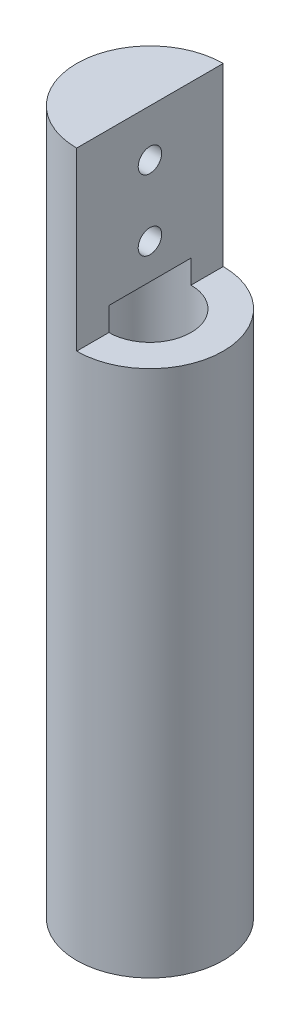
ISO-10303-21;
HEADER;
FILE_DESCRIPTION(('STEP AP214'),'2;1');
FILE_NAME('part.step','',(''),(''),'','','');
FILE_SCHEMA(('AUTOMOTIVE_DESIGN { 1 0 10303 214 1 1 1 1 }'));
ENDSEC;
DATA;
#1=APPLICATION_CONTEXT('core data for automotive mechanical design processes');
#2=APPLICATION_PROTOCOL_DEFINITION('international standard','automotive_design',2000,#1);
#3=PRODUCT_CONTEXT('',#1,'mechanical');
#4=PRODUCT('Part','Part','',(#3));
#5=PRODUCT_RELATED_PRODUCT_CATEGORY('part','',(#4));
#6=PRODUCT_DEFINITION_FORMATION('','',#4);
#7=PRODUCT_DEFINITION_CONTEXT('part definition',#1,'design');
#8=PRODUCT_DEFINITION('design','',#6,#7);
#9=PRODUCT_DEFINITION_SHAPE('','',#8);
#10=(LENGTH_UNIT() NAMED_UNIT(*) SI_UNIT(.MILLI.,.METRE.));
#11=(NAMED_UNIT(*) PLANE_ANGLE_UNIT() SI_UNIT($,.RADIAN.));
#12=(NAMED_UNIT(*) SI_UNIT($,.STERADIAN.) SOLID_ANGLE_UNIT());
#13=UNCERTAINTY_MEASURE_WITH_UNIT(LENGTH_MEASURE(1.E-05),#10,'distance_accuracy_value','');
#14=(GEOMETRIC_REPRESENTATION_CONTEXT(3) GLOBAL_UNCERTAINTY_ASSIGNED_CONTEXT((#13)) GLOBAL_UNIT_ASSIGNED_CONTEXT((#10,
#11,#12)) REPRESENTATION_CONTEXT('',''));
#15=CARTESIAN_POINT('',(0.,0.,0.));
#16=DIRECTION('',(0.,0.,1.));
#17=DIRECTION('',(1.,0.,0.));
#18=AXIS2_PLACEMENT_3D('',#15,#16,#17);
#19=CARTESIAN_POINT('',(0.,60.,0.));
#20=DIRECTION('',(0.,-1.,0.));
#21=DIRECTION('',(0.,0.,-1.));
#22=AXIS2_PLACEMENT_3D('',#19,#20,#21);
#23=CYLINDRICAL_SURFACE('',#22,6.25);
#24=CARTESIAN_POINT('',(-6.25,49.,0.));
#25=CARTESIAN_POINT('',(-6.24999906710497,49.0000022643151,-0.0557885100639667));
#26=CARTESIAN_POINT('',(-6.24924523381865,49.0046843036466,-0.111608261930167));
#27=CARTESIAN_POINT('',(-6.24631061709282,49.023282223849,-0.221684389829118));
#28=CARTESIAN_POINT('',(-6.24412848965522,49.0372068019501,-0.275939243067586));
#29=CARTESIAN_POINT('',(-6.23858223200645,49.073860440223,-0.381276885563142));
#30=CARTESIAN_POINT('',(-6.23521903869919,49.0965825230604,-0.432362151472));
#31=CARTESIAN_POINT('',(-6.22768119900577,49.1501683971989,-0.529987922172727));
#32=CARTESIAN_POINT('',(-6.22350665360427,49.1810311754418,-0.576528991474462));
#33=CARTESIAN_POINT('',(-6.21476821451689,49.2503128021312,-0.664163748023368));
#34=CARTESIAN_POINT('',(-6.21020150221518,49.2887894894726,-0.705211433262983));
#35=CARTESIAN_POINT('',(-6.20121519954691,49.3720822336375,-0.780297051418914));
#36=CARTESIAN_POINT('',(-6.19679561813248,49.4168986753343,-0.814334558453545));
#37=CARTESIAN_POINT('',(-6.18857666789098,49.511911943076,-0.87461582706607));
#38=CARTESIAN_POINT('',(-6.18478094174249,49.5621377186808,-0.900814499230483));
#39=CARTESIAN_POINT('',(-6.17827832974775,49.6663478314344,-0.944386154813034));
#40=CARTESIAN_POINT('',(-6.17557137625171,49.7203319348187,-0.961759686590047));
#41=CARTESIAN_POINT('',(-6.17158072371182,49.8300401884324,-0.987043793406639));
#42=CARTESIAN_POINT('',(-6.17028512650181,49.885745655475,-0.995033522252002));
#43=CARTESIAN_POINT('',(-6.16922783579555,49.9977204935427,-1.00156855668788));
#44=CARTESIAN_POINT('',(-6.16946604222119,50.0539898275372,-1.00011447847096));
#45=CARTESIAN_POINT('',(-6.17143857403019,50.1649325152495,-0.987867735290674));
#46=CARTESIAN_POINT('',(-6.17315870395883,50.2196159386805,-0.977163673632073));
#47=CARTESIAN_POINT('',(-6.17787906600869,50.326400535549,-0.946859717569204));
#48=CARTESIAN_POINT('',(-6.18087933888,50.3785016267254,-0.92725953997836));
#49=CARTESIAN_POINT('',(-6.18783740913301,50.4789096339279,-0.879628943736035));
#50=CARTESIAN_POINT('',(-6.19179940465345,50.5271986498427,-0.85156142908755));
#51=CARTESIAN_POINT('',(-6.20023154057462,50.6184151358427,-0.787819263161819));
#52=CARTESIAN_POINT('',(-6.20470171882556,50.6613422060616,-0.752144045077689));
#53=CARTESIAN_POINT('',(-6.21370906226269,50.7411294002187,-0.673714920439465));
#54=CARTESIAN_POINT('',(-6.21824641001355,50.7779147535344,-0.630884927728));
#55=CARTESIAN_POINT('',(-6.22682963542333,50.8437873694215,-0.539620187340265));
#56=CARTESIAN_POINT('',(-6.23087551035876,50.872874589335,-0.491185408608192));
#57=CARTESIAN_POINT('',(-6.2380250284972,50.922530839057,-0.390017944154561));
#58=CARTESIAN_POINT('',(-6.24112797878532,50.9430936086344,-0.337282133710767));
#59=CARTESIAN_POINT('',(-6.246036377968,50.975049678963,-0.229044916969888));
#60=CARTESIAN_POINT('',(-6.24784192679808,50.9864436859685,-0.173543724035369));
#61=CARTESIAN_POINT('',(-6.2499387322753,50.9996382350065,-0.0619960277009888));
#62=CARTESIAN_POINT('',(-6.25024619983784,51.0015414829788,-0.0059619668302225));
#63=CARTESIAN_POINT('',(-6.24935648754665,50.9959738091954,0.105624685755569));
#64=CARTESIAN_POINT('',(-6.24815936090275,50.9885032189443,0.161177294427142));
#65=CARTESIAN_POINT('',(-6.24440500076169,50.9644853509054,0.269909399117751));
#66=CARTESIAN_POINT('',(-6.24185533901278,50.9479885873477,0.323100337201038));
#67=CARTESIAN_POINT('',(-6.23568073073881,50.906440265735,0.425961495292994));
#68=CARTESIAN_POINT('',(-6.23205572782266,50.8813882590309,0.475631530495594));
#69=CARTESIAN_POINT('',(-6.22409260759213,50.8232030003483,0.570489325564433));
#70=CARTESIAN_POINT('',(-6.21974888779155,50.7900051819885,0.61563700154785));
#71=CARTESIAN_POINT('',(-6.21084797706853,50.7165599228187,0.69975707819764));
#72=CARTESIAN_POINT('',(-6.20629077194169,50.6763120124359,0.738729067201413));
#73=CARTESIAN_POINT('',(-6.19742451365368,50.589449805948,0.809769332650003));
#74=CARTESIAN_POINT('',(-6.1931182322689,50.5427786106066,0.841768437073598));
#75=CARTESIAN_POINT('',(-6.18529205150872,50.4446631094398,0.897472446050597));
#76=CARTESIAN_POINT('',(-6.18177212866728,50.3932189461114,0.921177598119176));
#77=CARTESIAN_POINT('',(-6.1759377060239,50.2872165203909,0.95951579177077));
#78=CARTESIAN_POINT('',(-6.17361852938612,50.2326712727011,0.97418407451258));
#79=CARTESIAN_POINT('',(-6.17043616110361,50.121851215004,0.994143592772298));
#80=CARTESIAN_POINT('',(-6.16957285371193,50.0655765428546,0.999435573742272));
#81=CARTESIAN_POINT('',(-6.16940468792846,49.9535852532817,1.00047273309197));
#82=CARTESIAN_POINT('',(-6.17008206410826,49.8978696402301,0.996326739107233));
#83=CARTESIAN_POINT('',(-6.17288014129105,49.7879393386864,0.978840089864877));
#84=CARTESIAN_POINT('',(-6.17500083863937,49.7337246463941,0.965499457889312));
#85=CARTESIAN_POINT('',(-6.18044007931005,49.6283723249918,0.930042609275316));
#86=CARTESIAN_POINT('',(-6.18375744215515,49.5772317211793,0.907935038850667));
#87=CARTESIAN_POINT('',(-6.1912174883704,49.4793677661635,0.855582886421217));
#88=CARTESIAN_POINT('',(-6.19536020736958,49.4326446057809,0.825337953122535));
#89=CARTESIAN_POINT('',(-6.20406084038506,49.3443907095817,0.757178317998384));
#90=CARTESIAN_POINT('',(-6.20862280108901,49.3029223760498,0.719183322904796));
#91=CARTESIAN_POINT('',(-6.21761500649877,49.2269123093012,0.636771671789766));
#92=CARTESIAN_POINT('',(-6.22204522048498,49.1923721809256,0.592353532010026));
#93=CARTESIAN_POINT('',(-6.23030702814576,49.1310012669141,0.498024173288674));
#94=CARTESIAN_POINT('',(-6.23413466326479,49.1042205630563,0.448080024897432));
#95=CARTESIAN_POINT('',(-6.2407214375234,49.0594693535505,0.344362583484336));
#96=CARTESIAN_POINT('',(-6.24348165781165,49.041489928448,0.290593230604882));
#97=CARTESIAN_POINT('',(-6.24700877948195,49.0188271306323,0.197167759419022));
#98=CARTESIAN_POINT('',(-6.24812458891587,49.0117780486036,0.158081738749348));
#99=CARTESIAN_POINT('',(-6.2496205253357,49.0023637135682,0.0793357400758528));
#100=CARTESIAN_POINT('',(-6.25000066345793,48.9999983896604,0.0396757707694141));
#101=CARTESIAN_POINT('',(-6.25,49.,0.));
#102=B_SPLINE_CURVE_WITH_KNOTS('',3,(#24,#25,#26,#27,#28,#29,#30,#31,#32,#33,#34,#35,#36,#37,
#38,#39,#40,#41,#42,#43,#44,#45,#46,#47,#48,#49,#50,#51,#52,#53,#54,#55,#56,#57,#58,#59,#60,#61,
#62,#63,#64,#65,#66,#67,#68,#69,#70,#71,#72,#73,#74,#75,#76,#77,#78,#79,#80,#81,#82,#83,#84,#85,
#86,#87,#88,#89,#90,#91,#92,#93,#94,#95,#96,#97,#98,#99,#100,#101),.UNSPECIFIED.,.T.,.F.,(4,2,2,
2,2,2,2,2,2,2,2,2,2,2,2,2,2,2,2,2,2,2,2,2,2,2,2,2,2,2,2,2,2,2,2,2,2,2,4),(0.,0.167220523311472,
0.334598624659732,0.501844248828423,0.669069070145514,0.837616673041163,1.0061745125064,
1.17568404812973,1.34518304982069,1.51324179234824,1.68128956943513,1.8477452794525,
2.01420628856096,2.18140743534158,2.34862104368742,2.51774156668694,2.6868630268186,
2.85610846818009,3.02534087160097,3.19273786075057,3.36012893009067,3.52659265113524,
3.69306510311128,3.86090229641922,4.02875067281635,4.19819513543302,4.3676345409126,
4.53640892880157,4.70516989787513,4.87199478423071,5.03881924816492,5.20547959243381,
5.37214713266493,5.54063815427023,5.70916815997366,5.87876284325117,6.04818529701758,
6.16711128334993,6.28603546940975),.UNSPECIFIED.);
#103=CARTESIAN_POINT('',(-6.25,49.,0.));
#104=VERTEX_POINT('',#103);
#105=EDGE_CURVE('E143',#104,#104,#102,.T.);
#106=ORIENTED_EDGE('',*,*,#105,.T.);
#107=EDGE_LOOP('',(#106));
#108=FACE_BOUND('',#107,.T.);
#109=CARTESIAN_POINT('',(-6.25,55.,0.));
#110=CARTESIAN_POINT('',(-6.24999906710497,55.0000022643151,-0.0557885100639667));
#111=CARTESIAN_POINT('',(-6.24924523381865,55.0046843036466,-0.111608261930167));
#112=CARTESIAN_POINT('',(-6.24631061709282,55.023282223849,-0.221684389829118));
#113=CARTESIAN_POINT('',(-6.24412848965522,55.0372068019501,-0.275939243067586));
#114=CARTESIAN_POINT('',(-6.23858223200645,55.073860440223,-0.381276885563143));
#115=CARTESIAN_POINT('',(-6.23521903869919,55.0965825230604,-0.432362151472002));
#116=CARTESIAN_POINT('',(-6.22768119900577,55.1501683971989,-0.529987922172729));
#117=CARTESIAN_POINT('',(-6.22350665360427,55.1810311754418,-0.576528991474463));
#118=CARTESIAN_POINT('',(-6.21476821451689,55.2503128021312,-0.66416374802337));
#119=CARTESIAN_POINT('',(-6.21020150221518,55.2887894894726,-0.705211433262985));
#120=CARTESIAN_POINT('',(-6.20121519954691,55.3720822336375,-0.780297051418916));
#121=CARTESIAN_POINT('',(-6.19679561813248,55.4168986753343,-0.814334558453546));
#122=CARTESIAN_POINT('',(-6.18857666789098,55.511911943076,-0.87461582706607));
#123=CARTESIAN_POINT('',(-6.18478094174249,55.5621377186808,-0.900814499230483));
#124=CARTESIAN_POINT('',(-6.17827832974775,55.6663478314344,-0.944386154813034));
#125=CARTESIAN_POINT('',(-6.17557137625171,55.7203319348187,-0.961759686590047));
#126=CARTESIAN_POINT('',(-6.17158072371182,55.8300401884324,-0.987043793406639));
#127=CARTESIAN_POINT('',(-6.17028512650181,55.885745655475,-0.995033522252002));
#128=CARTESIAN_POINT('',(-6.16922783579555,55.9977204935427,-1.00156855668788));
#129=CARTESIAN_POINT('',(-6.16946604222119,56.0539898275372,-1.00011447847096));
#130=CARTESIAN_POINT('',(-6.17143857403019,56.1649325152495,-0.987867735290674));
#131=CARTESIAN_POINT('',(-6.17315870395883,56.2196159386805,-0.977163673632073));
#132=CARTESIAN_POINT('',(-6.17787906600869,56.326400535549,-0.946859717569204));
#133=CARTESIAN_POINT('',(-6.18087933888,56.3785016267254,-0.92725953997836));
#134=CARTESIAN_POINT('',(-6.18783740913301,56.4789096339279,-0.879628943736035));
#135=CARTESIAN_POINT('',(-6.19179940465345,56.5271986498427,-0.85156142908755));
#136=CARTESIAN_POINT('',(-6.20023154057462,56.6184151358427,-0.787819263161819));
#137=CARTESIAN_POINT('',(-6.20470171882556,56.6613422060616,-0.752144045077689));
#138=CARTESIAN_POINT('',(-6.21370906226269,56.7411294002187,-0.673714920439464));
#139=CARTESIAN_POINT('',(-6.21824641001355,56.7779147535344,-0.630884927727998));
#140=CARTESIAN_POINT('',(-6.22682963542333,56.8437873694215,-0.539620187340262));
#141=CARTESIAN_POINT('',(-6.23087551035876,56.872874589335,-0.491185408608191));
#142=CARTESIAN_POINT('',(-6.2380250284972,56.922530839057,-0.390017944154561));
#143=CARTESIAN_POINT('',(-6.24112797878532,56.9430936086344,-0.337282133710766));
#144=CARTESIAN_POINT('',(-6.24603637796801,56.975049678963,-0.229044916969887));
#145=CARTESIAN_POINT('',(-6.24784192679808,56.9864436859685,-0.173543724035368));
#146=CARTESIAN_POINT('',(-6.2499387322753,56.9996382350065,-0.0619960277009888));
#147=CARTESIAN_POINT('',(-6.25024619983784,57.0015414829788,-0.00596196683022248));
#148=CARTESIAN_POINT('',(-6.24935648754665,56.9959738091954,0.105624685755569));
#149=CARTESIAN_POINT('',(-6.24815936090275,56.9885032189443,0.161177294427142));
#150=CARTESIAN_POINT('',(-6.24440500076169,56.9644853509054,0.269909399117752));
#151=CARTESIAN_POINT('',(-6.24185533901278,56.9479885873477,0.323100337201039));
#152=CARTESIAN_POINT('',(-6.23568073073881,56.906440265735,0.425961495292996));
#153=CARTESIAN_POINT('',(-6.23205572782266,56.8813882590309,0.475631530495595));
#154=CARTESIAN_POINT('',(-6.22409260759213,56.8232030003483,0.570489325564432));
#155=CARTESIAN_POINT('',(-6.21974888779155,56.7900051819885,0.615637001547847));
#156=CARTESIAN_POINT('',(-6.21084797706853,56.7165599228187,0.699757078197638));
#157=CARTESIAN_POINT('',(-6.20629077194169,56.6763120124359,0.738729067201412));
#158=CARTESIAN_POINT('',(-6.19742451365368,56.589449805948,0.809769332650003));
#159=CARTESIAN_POINT('',(-6.1931182322689,56.5427786106066,0.841768437073599));
#160=CARTESIAN_POINT('',(-6.18529205150872,56.4446631094398,0.897472446050597));
#161=CARTESIAN_POINT('',(-6.18177212866728,56.3932189461114,0.921177598119176));
#162=CARTESIAN_POINT('',(-6.1759377060239,56.2872165203909,0.959515791770771));
#163=CARTESIAN_POINT('',(-6.17361852938612,56.2326712727011,0.97418407451258));
#164=CARTESIAN_POINT('',(-6.17043616110361,56.121851215004,0.994143592772298));
#165=CARTESIAN_POINT('',(-6.16957285371193,56.0655765428546,0.999435573742272));
#166=CARTESIAN_POINT('',(-6.16940468792846,55.9535852532817,1.00047273309197));
#167=CARTESIAN_POINT('',(-6.17008206410826,55.8978696402301,0.996326739107233));
#168=CARTESIAN_POINT('',(-6.17288014129105,55.7879393386864,0.978840089864877));
#169=CARTESIAN_POINT('',(-6.17500083863937,55.733724646394,0.965499457889312));
#170=CARTESIAN_POINT('',(-6.18044007931005,55.6283723249918,0.930042609275316));
#171=CARTESIAN_POINT('',(-6.18375744215515,55.5772317211793,0.907935038850667));
#172=CARTESIAN_POINT('',(-6.1912174883704,55.4793677661635,0.855582886421217));
#173=CARTESIAN_POINT('',(-6.19536020736957,55.4326446057809,0.825337953122535));
#174=CARTESIAN_POINT('',(-6.20406084038506,55.3443907095817,0.757178317998385));
#175=CARTESIAN_POINT('',(-6.20862280108901,55.3029223760498,0.719183322904798));
#176=CARTESIAN_POINT('',(-6.21761500649877,55.2269123093012,0.636771671789769));
#177=CARTESIAN_POINT('',(-6.22204522048498,55.1923721809256,0.592353532010028));
#178=CARTESIAN_POINT('',(-6.23030702814576,55.1310012669141,0.498024173288672));
#179=CARTESIAN_POINT('',(-6.23413466326479,55.1042205630563,0.44808002489743));
#180=CARTESIAN_POINT('',(-6.2407214375234,55.0594693535505,0.344362583484334));
#181=CARTESIAN_POINT('',(-6.24348165781165,55.041489928448,0.290593230604881));
#182=CARTESIAN_POINT('',(-6.24700877948195,55.0188271306323,0.197167759419022));
#183=CARTESIAN_POINT('',(-6.24812458891587,55.0117780486036,0.158081738749348));
#184=CARTESIAN_POINT('',(-6.2496205253357,55.0023637135682,0.0793357400758528));
#185=CARTESIAN_POINT('',(-6.25000066345793,54.9999983896604,0.0396757707694141));
#186=CARTESIAN_POINT('',(-6.25,55.,0.));
#187=B_SPLINE_CURVE_WITH_KNOTS('',3,(#109,#110,#111,#112,#113,#114,#115,#116,#117,#118,#119,
#120,#121,#122,#123,#124,#125,#126,#127,#128,#129,#130,#131,#132,#133,#134,#135,#136,#137,#138,
#139,#140,#141,#142,#143,#144,#145,#146,#147,#148,#149,#150,#151,#152,#153,#154,#155,#156,#157,
#158,#159,#160,#161,#162,#163,#164,#165,#166,#167,#168,#169,#170,#171,#172,#173,#174,#175,#176,
#177,#178,#179,#180,#181,#182,#183,#184,#185,#186),.UNSPECIFIED.,.T.,.F.,(4,2,2,2,2,2,2,2,2,2,2,
2,2,2,2,2,2,2,2,2,2,2,2,2,2,2,2,2,2,2,2,2,2,2,2,2,2,2,4),(0.,0.167220523311472,
0.334598624659732,0.501844248828425,0.669069070145515,0.837616673041171,1.0061745125064,
1.17568404812973,1.34518304982069,1.51324179234825,1.68128956943513,1.8477452794525,
2.01420628856096,2.18140743534158,2.34862104368742,2.51774156668695,2.6868630268186,
2.85610846818009,3.02534087160097,3.19273786075057,3.36012893009067,3.52659265113524,
3.69306510311128,3.86090229641922,4.02875067281635,4.19819513543302,4.3676345409126,
4.53640892880157,4.70516989787513,4.87199478423071,5.03881924816492,5.20547959243381,
5.37214713266493,5.54063815427023,5.70916815997366,5.87876284325118,6.04818529701758,
6.16711128334993,6.28603546940975),.UNSPECIFIED.);
#188=CARTESIAN_POINT('',(-6.25,55.,0.));
#189=VERTEX_POINT('',#188);
#190=EDGE_CURVE('E147',#189,#189,#187,.T.);
#191=ORIENTED_EDGE('',*,*,#190,.T.);
#192=EDGE_LOOP('',(#191));
#193=FACE_BOUND('',#192,.T.);
#194=CARTESIAN_POINT('',(0.,60.,0.));
#195=DIRECTION('',(0.,1.,0.));
#196=DIRECTION('',(0.,0.,1.));
#197=AXIS2_PLACEMENT_3D('',#194,#195,#196);
#198=CIRCLE('',#197,6.25);
#199=CARTESIAN_POINT('',(0.,60.,-6.25));
#200=VERTEX_POINT('',#199);
#201=CARTESIAN_POINT('',(0.,60.,6.25));
#202=VERTEX_POINT('',#201);
#203=EDGE_CURVE('E47',#200,#202,#198,.T.);
#204=ORIENTED_EDGE('',*,*,#203,.F.);
#205=DIRECTION('',(0.,1.,0.));
#206=VECTOR('',#205,1.);
#207=CARTESIAN_POINT('',(0.,45.,-6.25));
#208=LINE('',#207,#206);
#209=CARTESIAN_POINT('',(0.,45.,-6.25));
#210=VERTEX_POINT('',#209);
#211=EDGE_CURVE('E62',#210,#200,#208,.T.);
#212=ORIENTED_EDGE('',*,*,#211,.F.);
#213=CARTESIAN_POINT('',(0.,45.,0.));
#214=DIRECTION('',(0.,1.,0.));
#215=DIRECTION('',(0.,0.,1.));
#216=AXIS2_PLACEMENT_3D('',#213,#214,#215);
#217=CIRCLE('',#216,6.25);
#218=CARTESIAN_POINT('',(0.,45.,6.25));
#219=VERTEX_POINT('',#218);
#220=EDGE_CURVE('E96',#219,#210,#217,.T.);
#221=ORIENTED_EDGE('',*,*,#220,.F.);
#222=DIRECTION('',(0.,1.,0.));
#223=VECTOR('',#222,1.);
#224=CARTESIAN_POINT('',(0.,45.,6.25));
#225=LINE('',#224,#223);
#226=EDGE_CURVE('E102',#219,#202,#225,.T.);
#227=ORIENTED_EDGE('',*,*,#226,.T.);
#228=EDGE_LOOP('',(#204,#212,#221,#227));
#229=FACE_BOUND('',#228,.T.);
#230=CARTESIAN_POINT('',(0.,0.,0.));
#231=DIRECTION('',(0.,1.,0.));
#232=DIRECTION('',(0.,0.,1.));
#233=AXIS2_PLACEMENT_3D('',#230,#231,#232);
#234=CIRCLE('',#233,6.25);
#235=CARTESIAN_POINT('',(0.,0.,6.25));
#236=VERTEX_POINT('',#235);
#237=EDGE_CURVE('E111',#236,#236,#234,.T.);
#238=ORIENTED_EDGE('',*,*,#237,.T.);
#239=EDGE_LOOP('',(#238));
#240=FACE_BOUND('',#239,.T.);
#241=ADVANCED_FACE('F38',(#108,#193,#229,#240),#23,.T.);
#242=CARTESIAN_POINT('',(0.,60.,0.));
#243=DIRECTION('',(0.,1.,0.));
#244=DIRECTION('',(0.,0.,1.));
#245=AXIS2_PLACEMENT_3D('',#242,#243,#244);
#246=PLANE('',#245);
#247=DIRECTION('',(0.,0.,1.));
#248=VECTOR('',#247,1.);
#249=CARTESIAN_POINT('',(0.,60.,-6.25));
#250=LINE('',#249,#248);
#251=EDGE_CURVE('E106',#200,#202,#250,.T.);
#252=ORIENTED_EDGE('',*,*,#251,.F.);
#253=ORIENTED_EDGE('',*,*,#203,.T.);
#254=EDGE_LOOP('',(#252,#253));
#255=FACE_BOUND('',#254,.T.);
#256=ADVANCED_FACE('F122',(#255),#246,.T.);
#257=CARTESIAN_POINT('',(0.,0.,0.));
#258=DIRECTION('',(0.,1.,0.));
#259=DIRECTION('',(0.,0.,1.));
#260=AXIS2_PLACEMENT_3D('',#257,#258,#259);
#261=PLANE('',#260);
#262=CARTESIAN_POINT('',(4.5,0.,0.));
#263=DIRECTION('',(0.,-1.,0.));
#264=DIRECTION('',(0.,0.,1.));
#265=AXIS2_PLACEMENT_3D('',#262,#263,#264);
#266=CIRCLE('',#265,0.75);
#267=CARTESIAN_POINT('',(4.5,0.,0.75));
#268=VERTEX_POINT('',#267);
#269=EDGE_CURVE('E183',#268,#268,#266,.T.);
#270=ORIENTED_EDGE('',*,*,#269,.F.);
#271=EDGE_LOOP('',(#270));
#272=FACE_BOUND('',#271,.T.);
#273=CARTESIAN_POINT('',(-4.5,0.,0.));
#274=DIRECTION('',(0.,-1.,0.));
#275=DIRECTION('',(0.,0.,-1.));
#276=AXIS2_PLACEMENT_3D('',#273,#274,#275);
#277=CIRCLE('',#276,0.75);
#278=CARTESIAN_POINT('',(-4.5,0.,-0.75));
#279=VERTEX_POINT('',#278);
#280=EDGE_CURVE('E175',#279,#279,#277,.T.);
#281=ORIENTED_EDGE('',*,*,#280,.F.);
#282=EDGE_LOOP('',(#281));
#283=FACE_BOUND('',#282,.T.);
#284=CARTESIAN_POINT('',(0.,0.,0.));
#285=DIRECTION('',(0.,1.,0.));
#286=DIRECTION('',(0.,0.,1.));
#287=AXIS2_PLACEMENT_3D('',#284,#285,#286);
#288=CIRCLE('',#287,3.5);
#289=CARTESIAN_POINT('',(0.,0.,3.5));
#290=VERTEX_POINT('',#289);
#291=EDGE_CURVE('E92',#290,#290,#288,.T.);
#292=ORIENTED_EDGE('',*,*,#291,.T.);
#293=EDGE_LOOP('',(#292));
#294=FACE_BOUND('',#293,.T.);
#295=ORIENTED_EDGE('',*,*,#237,.F.);
#296=EDGE_LOOP('',(#295));
#297=FACE_BOUND('',#296,.T.);
#298=ADVANCED_FACE('F120',(#272,#283,#294,#297),#261,.F.);
#299=CARTESIAN_POINT('',(0.,45.,-6.25));
#300=DIRECTION('',(-1.,0.,0.));
#301=DIRECTION('',(0.,0.,1.));
#302=AXIS2_PLACEMENT_3D('',#299,#300,#301);
#303=PLANE('',#302);
#304=CARTESIAN_POINT('',(0.,50.,0.));
#305=DIRECTION('',(1.,0.,0.));
#306=DIRECTION('',(0.,0.,-1.));
#307=AXIS2_PLACEMENT_3D('',#304,#305,#306);
#308=CIRCLE('',#307,1.);
#309=CARTESIAN_POINT('',(0.,50.,-1.));
#310=VERTEX_POINT('',#309);
#311=EDGE_CURVE('E167',#310,#310,#308,.T.);
#312=ORIENTED_EDGE('',*,*,#311,.F.);
#313=EDGE_LOOP('',(#312));
#314=FACE_BOUND('',#313,.T.);
#315=CARTESIAN_POINT('',(0.,56.,0.));
#316=DIRECTION('',(1.,0.,0.));
#317=DIRECTION('',(0.,0.,-1.));
#318=AXIS2_PLACEMENT_3D('',#315,#316,#317);
#319=CIRCLE('',#318,1.);
#320=CARTESIAN_POINT('',(0.,56.,-1.));
#321=VERTEX_POINT('',#320);
#322=EDGE_CURVE('E161',#321,#321,#319,.T.);
#323=ORIENTED_EDGE('',*,*,#322,.F.);
#324=EDGE_LOOP('',(#323));
#325=FACE_BOUND('',#324,.T.);
#326=DIRECTION('',(0.,0.,1.));
#327=VECTOR('',#326,1.);
#328=CARTESIAN_POINT('',(0.,47.,-6.25));
#329=LINE('',#328,#327);
#330=CARTESIAN_POINT('',(0.,47.,-3.5));
#331=VERTEX_POINT('',#330);
#332=CARTESIAN_POINT('',(0.,47.,3.5));
#333=VERTEX_POINT('',#332);
#334=EDGE_CURVE('E11',#331,#333,#329,.T.);
#335=ORIENTED_EDGE('',*,*,#334,.F.);
#336=DIRECTION('',(0.,-1.,0.));
#337=VECTOR('',#336,1.);
#338=CARTESIAN_POINT('',(0.,47.,-3.5));
#339=LINE('',#338,#337);
#340=CARTESIAN_POINT('',(0.,45.,-3.5));
#341=VERTEX_POINT('',#340);
#342=EDGE_CURVE('E80',#331,#341,#339,.T.);
#343=ORIENTED_EDGE('',*,*,#342,.T.);
#344=DIRECTION('',(0.,0.,1.));
#345=VECTOR('',#344,1.);
#346=CARTESIAN_POINT('',(0.,45.,-6.25));
#347=LINE('',#346,#345);
#348=EDGE_CURVE('E83',#210,#341,#347,.T.);
#349=ORIENTED_EDGE('',*,*,#348,.F.);
#350=ORIENTED_EDGE('',*,*,#211,.T.);
#351=ORIENTED_EDGE('',*,*,#251,.T.);
#352=ORIENTED_EDGE('',*,*,#226,.F.);
#353=CARTESIAN_POINT('',(0.,45.,3.5));
#354=VERTEX_POINT('',#353);
#355=EDGE_CURVE('E98',#354,#219,#347,.T.);
#356=ORIENTED_EDGE('',*,*,#355,.F.);
#357=DIRECTION('',(0.,-1.,0.));
#358=VECTOR('',#357,1.);
#359=CARTESIAN_POINT('',(0.,47.,3.5));
#360=LINE('',#359,#358);
#361=EDGE_CURVE('E54',#354,#333,#360,.F.);
#362=ORIENTED_EDGE('',*,*,#361,.T.);
#363=EDGE_LOOP('',(#335,#343,#349,#350,#351,#352,#356,#362));
#364=FACE_BOUND('',#363,.T.);
#365=ADVANCED_FACE('F81',(#314,#325,#364),#303,.F.);
#366=CARTESIAN_POINT('',(0.,45.,0.));
#367=DIRECTION('',(0.,1.,0.));
#368=DIRECTION('',(0.,0.,1.));
#369=AXIS2_PLACEMENT_3D('',#366,#367,#368);
#370=PLANE('',#369);
#371=CARTESIAN_POINT('',(0.,45.,0.));
#372=DIRECTION('',(0.,1.,0.));
#373=DIRECTION('',(0.,0.,1.));
#374=AXIS2_PLACEMENT_3D('',#371,#372,#373);
#375=CIRCLE('',#374,3.5);
#376=EDGE_CURVE('E86',#354,#341,#375,.T.);
#377=ORIENTED_EDGE('',*,*,#376,.F.);
#378=ORIENTED_EDGE('',*,*,#355,.T.);
#379=ORIENTED_EDGE('',*,*,#220,.T.);
#380=ORIENTED_EDGE('',*,*,#348,.T.);
#381=EDGE_LOOP('',(#377,#378,#379,#380));
#382=FACE_BOUND('',#381,.T.);
#383=ADVANCED_FACE('F94',(#382),#370,.T.);
#384=CARTESIAN_POINT('',(0.,0.,0.));
#385=DIRECTION('',(0.,1.,0.));
#386=DIRECTION('',(0.,0.,1.));
#387=AXIS2_PLACEMENT_3D('',#384,#385,#386);
#388=CYLINDRICAL_SURFACE('',#387,3.5);
#389=ORIENTED_EDGE('',*,*,#291,.F.);
#390=EDGE_LOOP('',(#389));
#391=FACE_BOUND('',#390,.T.);
#392=ORIENTED_EDGE('',*,*,#376,.T.);
#393=ORIENTED_EDGE('',*,*,#342,.F.);
#394=CARTESIAN_POINT('',(0.,47.,0.));
#395=DIRECTION('',(0.,-1.,0.));
#396=DIRECTION('',(0.,0.,-1.));
#397=AXIS2_PLACEMENT_3D('',#394,#395,#396);
#398=CIRCLE('',#397,3.5);
#399=EDGE_CURVE('E156',#333,#331,#398,.T.);
#400=ORIENTED_EDGE('',*,*,#399,.F.);
#401=ORIENTED_EDGE('',*,*,#361,.F.);
#402=EDGE_LOOP('',(#392,#393,#400,#401));
#403=FACE_BOUND('',#402,.T.);
#404=ADVANCED_FACE('F88',(#391,#403),#388,.F.);
#405=CARTESIAN_POINT('',(0.,47.,0.));
#406=DIRECTION('',(0.,-1.,0.));
#407=DIRECTION('',(0.,0.,-1.));
#408=AXIS2_PLACEMENT_3D('',#405,#406,#407);
#409=PLANE('',#408);
#410=ORIENTED_EDGE('',*,*,#334,.T.);
#411=ORIENTED_EDGE('',*,*,#399,.T.);
#412=EDGE_LOOP('',(#410,#411));
#413=FACE_BOUND('',#412,.T.);
#414=ADVANCED_FACE('F204',(#413),#409,.T.);
#415=CARTESIAN_POINT('',(-6.25,56.,0.));
#416=DIRECTION('',(1.,0.,0.));
#417=DIRECTION('',(0.,0.,-1.));
#418=AXIS2_PLACEMENT_3D('',#415,#416,#417);
#419=CYLINDRICAL_SURFACE('',#418,1.);
#420=ORIENTED_EDGE('',*,*,#322,.T.);
#421=EDGE_LOOP('',(#420));
#422=FACE_BOUND('',#421,.T.);
#423=ORIENTED_EDGE('',*,*,#190,.F.);
#424=EDGE_LOOP('',(#423));
#425=FACE_BOUND('',#424,.T.);
#426=ADVANCED_FACE('F198',(#422,#425),#419,.F.);
#427=CARTESIAN_POINT('',(-6.25,50.,0.));
#428=DIRECTION('',(1.,0.,0.));
#429=DIRECTION('',(0.,0.,-1.));
#430=AXIS2_PLACEMENT_3D('',#427,#428,#429);
#431=CYLINDRICAL_SURFACE('',#430,1.);
#432=ORIENTED_EDGE('',*,*,#311,.T.);
#433=EDGE_LOOP('',(#432));
#434=FACE_BOUND('',#433,.T.);
#435=ORIENTED_EDGE('',*,*,#105,.F.);
#436=EDGE_LOOP('',(#435));
#437=FACE_BOUND('',#436,.T.);
#438=ADVANCED_FACE('F192',(#434,#437),#431,.F.);
#439=CARTESIAN_POINT('',(-4.5,5.,0.));
#440=DIRECTION('',(0.,-1.,0.));
#441=DIRECTION('',(0.,0.,-1.));
#442=AXIS2_PLACEMENT_3D('',#439,#440,#441);
#443=CYLINDRICAL_SURFACE('',#442,0.75);
#444=CARTESIAN_POINT('',(-4.5,5.,0.));
#445=DIRECTION('',(0.,-1.,0.));
#446=DIRECTION('',(0.,0.,-1.));
#447=AXIS2_PLACEMENT_3D('',#444,#445,#446);
#448=CIRCLE('',#447,0.75);
#449=CARTESIAN_POINT('',(-4.5,5.,-0.75));
#450=VERTEX_POINT('',#449);
#451=EDGE_CURVE('E171',#450,#450,#448,.T.);
#452=ORIENTED_EDGE('',*,*,#451,.F.);
#453=EDGE_LOOP('',(#452));
#454=FACE_BOUND('',#453,.T.);
#455=ORIENTED_EDGE('',*,*,#280,.T.);
#456=EDGE_LOOP('',(#455));
#457=FACE_BOUND('',#456,.T.);
#458=ADVANCED_FACE('F197',(#454,#457),#443,.F.);
#459=CARTESIAN_POINT('',(-4.5,5.,0.));
#460=DIRECTION('',(0.,-1.,0.));
#461=DIRECTION('',(0.,0.,-1.));
#462=AXIS2_PLACEMENT_3D('',#459,#460,#461);
#463=PLANE('',#462);
#464=ORIENTED_EDGE('',*,*,#451,.T.);
#465=EDGE_LOOP('',(#464));
#466=FACE_BOUND('',#465,.T.);
#467=ADVANCED_FACE('F243',(#466),#463,.T.);
#468=CARTESIAN_POINT('',(4.5,5.,0.));
#469=DIRECTION('',(0.,-1.,0.));
#470=DIRECTION('',(0.,0.,-1.));
#471=AXIS2_PLACEMENT_3D('',#468,#469,#470);
#472=CYLINDRICAL_SURFACE('',#471,0.75);
#473=CARTESIAN_POINT('',(4.5,5.,0.));
#474=DIRECTION('',(0.,-1.,0.));
#475=DIRECTION('',(0.,0.,1.));
#476=AXIS2_PLACEMENT_3D('',#473,#474,#475);
#477=CIRCLE('',#476,0.75);
#478=CARTESIAN_POINT('',(4.5,5.,0.75));
#479=VERTEX_POINT('',#478);
#480=EDGE_CURVE('E179',#479,#479,#477,.T.);
#481=ORIENTED_EDGE('',*,*,#480,.F.);
#482=EDGE_LOOP('',(#481));
#483=FACE_BOUND('',#482,.T.);
#484=ORIENTED_EDGE('',*,*,#269,.T.);
#485=EDGE_LOOP('',(#484));
#486=FACE_BOUND('',#485,.T.);
#487=ADVANCED_FACE('F249',(#483,#486),#472,.F.);
#488=CARTESIAN_POINT('',(4.5,5.,0.));
#489=DIRECTION('',(0.,-1.,0.));
#490=DIRECTION('',(0.,0.,1.));
#491=AXIS2_PLACEMENT_3D('',#488,#489,#490);
#492=PLANE('',#491);
#493=ORIENTED_EDGE('',*,*,#480,.T.);
#494=EDGE_LOOP('',(#493));
#495=FACE_BOUND('',#494,.T.);
#496=ADVANCED_FACE('F255',(#495),#492,.T.);
#497=CLOSED_SHELL('',(#241,#256,#298,#365,#383,#404,#414,#426,#438,#458,#467,#487,#496));
#498=MANIFOLD_SOLID_BREP('B2',#497);
#499=ADVANCED_BREP_SHAPE_REPRESENTATION('',(#18,#498),#14);
#500=SHAPE_DEFINITION_REPRESENTATION(#9,#499);
ENDSEC;
END-ISO-10303-21;
